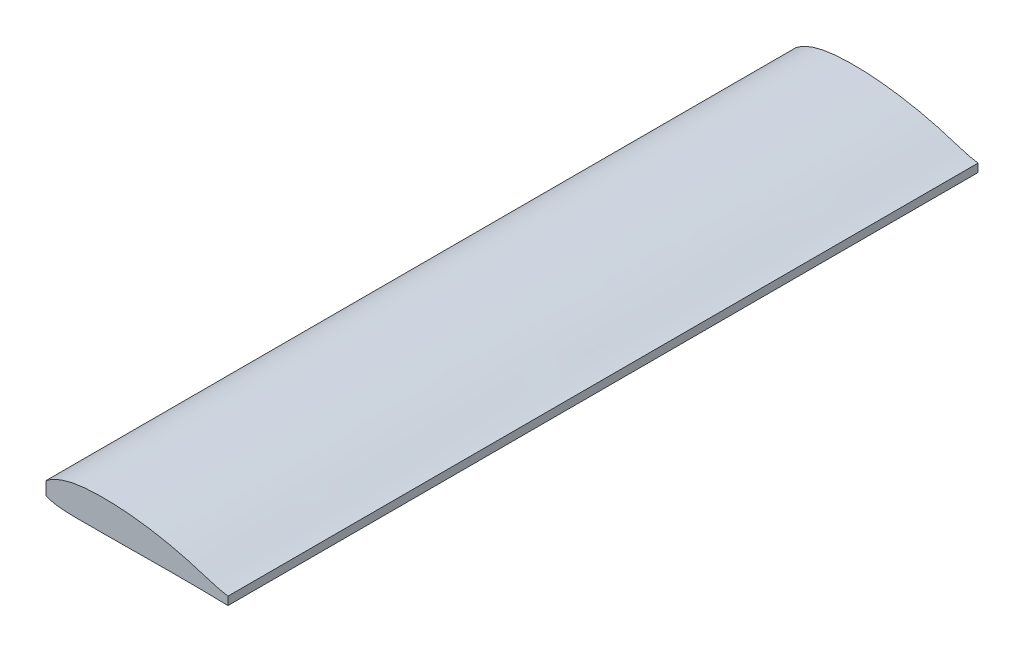
ISO-10303-21;
HEADER;
FILE_DESCRIPTION(('STEP AP214'),'2;1');
FILE_NAME('part.step','',(''),(''),'','','');
FILE_SCHEMA(('AUTOMOTIVE_DESIGN { 1 0 10303 214 1 1 1 1 }'));
ENDSEC;
DATA;
#1=APPLICATION_CONTEXT('core data for automotive mechanical design processes');
#2=APPLICATION_PROTOCOL_DEFINITION('international standard','automotive_design',2000,#1);
#3=PRODUCT_CONTEXT('',#1,'mechanical');
#4=PRODUCT('Part','Part','',(#3));
#5=PRODUCT_RELATED_PRODUCT_CATEGORY('part','',(#4));
#6=PRODUCT_DEFINITION_FORMATION('','',#4);
#7=PRODUCT_DEFINITION_CONTEXT('part definition',#1,'design');
#8=PRODUCT_DEFINITION('design','',#6,#7);
#9=PRODUCT_DEFINITION_SHAPE('','',#8);
#10=(LENGTH_UNIT() NAMED_UNIT(*) SI_UNIT(.MILLI.,.METRE.));
#11=(NAMED_UNIT(*) PLANE_ANGLE_UNIT() SI_UNIT($,.RADIAN.));
#12=(NAMED_UNIT(*) SI_UNIT($,.STERADIAN.) SOLID_ANGLE_UNIT());
#13=UNCERTAINTY_MEASURE_WITH_UNIT(LENGTH_MEASURE(1.E-05),#10,'distance_accuracy_value','');
#14=(GEOMETRIC_REPRESENTATION_CONTEXT(3) GLOBAL_UNCERTAINTY_ASSIGNED_CONTEXT((#13)) GLOBAL_UNIT_ASSIGNED_CONTEXT((#10,
#11,#12)) REPRESENTATION_CONTEXT('',''));
#15=CARTESIAN_POINT('',(0.,0.,0.));
#16=DIRECTION('',(0.,0.,1.));
#17=DIRECTION('',(1.,0.,0.));
#18=AXIS2_PLACEMENT_3D('',#15,#16,#17);
#19=CARTESIAN_POINT('',(-63.4540757757714,-9.25598325643386,-450.));
#20=CARTESIAN_POINT('',(-54.0351444598893,-15.0654729766079,-450.));
#21=CARTESIAN_POINT('',(10.6002544080413,-16.0386683097575,-450.));
#22=CARTESIAN_POINT('',(100.614002117736,-13.7875839752063,-450.));
#23=CARTESIAN_POINT('',(156.545924224229,-15.4448692068075,-450.));
#24=B_SPLINE_CURVE_WITH_KNOTS('',3,(#19,#20,#21,#22,#23),.UNSPECIFIED.,.F.,.F.,(4,1,4),(0.,
0.231899451469251,1.),.UNSPECIFIED.);
#25=DIRECTION('',(0.,0.,1.));
#26=VECTOR('',#25,1.);
#27=SURFACE_OF_LINEAR_EXTRUSION('',#24,#26);
#28=DIRECTION('',(0.,0.,1.));
#29=VECTOR('',#28,1.);
#30=CARTESIAN_POINT('',(-61.8161263304696,-10.1824199040912,-450.));
#31=LINE('',#30,#29);
#32=CARTESIAN_POINT('',(-61.8161263304696,-10.1824199035204,-450.));
#33=VERTEX_POINT('',#32);
#34=CARTESIAN_POINT('',(-61.8161263315707,-10.1824199035204,450.));
#35=VERTEX_POINT('',#34);
#36=EDGE_CURVE('E50',#33,#35,#31,.T.);
#37=ORIENTED_EDGE('',*,*,#36,.F.);
#38=CARTESIAN_POINT('',(156.545924224229,-15.4448692068075,-450.));
#39=VERTEX_POINT('',#38);
#40=EDGE_CURVE('E88',#33,#39,#24,.T.);
#41=ORIENTED_EDGE('',*,*,#40,.T.);
#42=DIRECTION('',(0.,0.,1.));
#43=VECTOR('',#42,1.);
#44=CARTESIAN_POINT('',(156.545924224229,-15.4448692068075,-450.));
#45=LINE('',#44,#43);
#46=CARTESIAN_POINT('',(156.545924224229,-15.4448692068075,450.));
#47=VERTEX_POINT('',#46);
#48=EDGE_CURVE('E112',#39,#47,#45,.T.);
#49=ORIENTED_EDGE('',*,*,#48,.T.);
#50=CARTESIAN_POINT('',(-63.4540757757714,-9.25598325643386,450.));
#51=CARTESIAN_POINT('',(-54.0351444598893,-15.0654729766079,450.));
#52=CARTESIAN_POINT('',(10.6002544080413,-16.0386683097575,450.));
#53=CARTESIAN_POINT('',(100.614002117736,-13.7875839752063,450.));
#54=CARTESIAN_POINT('',(156.545924224229,-15.4448692068075,450.));
#55=B_SPLINE_CURVE_WITH_KNOTS('',3,(#50,#51,#52,#53,#54),.UNSPECIFIED.,.F.,.F.,(4,1,4),(0.,
0.231899451469251,1.),.UNSPECIFIED.);
#56=EDGE_CURVE('E91',#35,#47,#55,.T.);
#57=ORIENTED_EDGE('',*,*,#56,.F.);
#58=EDGE_LOOP('',(#37,#41,#49,#57));
#59=FACE_BOUND('',#58,.T.);
#60=ADVANCED_FACE('F35',(#59),#27,.T.);
#61=CARTESIAN_POINT('',(156.545924224229,-5.59219082881144,-450.));
#62=CARTESIAN_POINT('',(145.15488491756,-4.0867309047516,-450.));
#63=CARTESIAN_POINT('',(97.0432886292072,13.2048715110859,-450.));
#64=CARTESIAN_POINT('',(12.4624646532749,27.2231836560255,-450.));
#65=CARTESIAN_POINT('',(-47.4947704977808,17.3868082440156,-450.));
#66=CARTESIAN_POINT('',(-63.4540757757714,3.9562722725695,-450.));
#67=B_SPLINE_CURVE_WITH_KNOTS('',3,(#61,#62,#63,#64,#65,#66),.UNSPECIFIED.,.F.,.F.,(4,1,1,4),
(0.,0.166541343545136,0.680643308012216,1.),.UNSPECIFIED.);
#68=DIRECTION('',(0.,0.,1.));
#69=VECTOR('',#68,1.);
#70=SURFACE_OF_LINEAR_EXTRUSION('',#67,#69);
#71=DIRECTION('',(0.,0.,1.));
#72=VECTOR('',#71,1.);
#73=CARTESIAN_POINT('',(-61.8161263304696,5.28203326129564,-450.));
#74=LINE('',#73,#72);
#75=CARTESIAN_POINT('',(-61.8161263304696,5.28203326886805,450.));
#76=VERTEX_POINT('',#75);
#77=CARTESIAN_POINT('',(-61.8161263304696,5.28203326886805,-450.));
#78=VERTEX_POINT('',#77);
#79=EDGE_CURVE('E74',#76,#78,#74,.F.);
#80=ORIENTED_EDGE('',*,*,#79,.F.);
#81=CARTESIAN_POINT('',(156.545924224229,-5.59219082881144,450.));
#82=CARTESIAN_POINT('',(145.15488491756,-4.0867309047516,450.));
#83=CARTESIAN_POINT('',(97.0432886292072,13.2048715110859,450.));
#84=CARTESIAN_POINT('',(12.4624646532749,27.2231836560255,450.));
#85=CARTESIAN_POINT('',(-47.4947704977808,17.3868082440156,450.));
#86=CARTESIAN_POINT('',(-63.4540757757714,3.9562722725695,450.));
#87=B_SPLINE_CURVE_WITH_KNOTS('',3,(#81,#82,#83,#84,#85,#86),.UNSPECIFIED.,.F.,.F.,(4,1,1,4),
(0.,0.166541343545136,0.680643308012216,1.),.UNSPECIFIED.);
#88=CARTESIAN_POINT('',(156.545924224229,-5.59219082881144,450.));
#89=VERTEX_POINT('',#88);
#90=EDGE_CURVE('E80',#89,#76,#87,.T.);
#91=ORIENTED_EDGE('',*,*,#90,.F.);
#92=DIRECTION('',(0.,0.,1.));
#93=VECTOR('',#92,1.);
#94=CARTESIAN_POINT('',(156.545924224229,-5.59219082881144,-450.));
#95=LINE('',#94,#93);
#96=CARTESIAN_POINT('',(156.545924224229,-5.59219082881144,-450.));
#97=VERTEX_POINT('',#96);
#98=EDGE_CURVE('E43',#97,#89,#95,.T.);
#99=ORIENTED_EDGE('',*,*,#98,.F.);
#100=EDGE_CURVE('E81',#97,#78,#67,.T.);
#101=ORIENTED_EDGE('',*,*,#100,.T.);
#102=EDGE_LOOP('',(#80,#91,#99,#101));
#103=FACE_BOUND('',#102,.T.);
#104=ADVANCED_FACE('F79',(#103),#70,.T.);
#105=CARTESIAN_POINT('',(156.545924224229,-5.59219082881144,-450.));
#106=DIRECTION('',(1.,0.,0.));
#107=DIRECTION('',(0.,0.,-1.));
#108=AXIS2_PLACEMENT_3D('',#105,#106,#107);
#109=PLANE('',#108);
#110=ORIENTED_EDGE('',*,*,#98,.T.);
#111=DIRECTION('',(0.,1.,0.));
#112=VECTOR('',#111,1.);
#113=CARTESIAN_POINT('',(156.545924224229,-5.59219082881144,450.));
#114=LINE('',#113,#112);
#115=EDGE_CURVE('E87',#47,#89,#114,.T.);
#116=ORIENTED_EDGE('',*,*,#115,.F.);
#117=ORIENTED_EDGE('',*,*,#48,.F.);
#118=DIRECTION('',(0.,1.,0.));
#119=VECTOR('',#118,1.);
#120=CARTESIAN_POINT('',(156.545924224229,-5.59219082881144,-450.));
#121=LINE('',#120,#119);
#122=EDGE_CURVE('E90',#39,#97,#121,.T.);
#123=ORIENTED_EDGE('',*,*,#122,.T.);
#124=EDGE_LOOP('',(#110,#116,#117,#123));
#125=FACE_BOUND('',#124,.T.);
#126=ADVANCED_FACE('F119',(#125),#109,.T.);
#127=CARTESIAN_POINT('',(38.3013896104652,-15.0544374492117,-450.));
#128=DIRECTION('',(0.,0.,-1.));
#129=DIRECTION('',(-1.,0.,0.));
#130=AXIS2_PLACEMENT_3D('',#127,#128,#129);
#131=PLANE('',#130);
#132=DIRECTION('',(0.,1.,0.));
#133=VECTOR('',#132,1.);
#134=CARTESIAN_POINT('',(-61.8161263304696,-16.0386683097575,-450.));
#135=LINE('',#134,#133);
#136=EDGE_CURVE('E82',#33,#78,#135,.T.);
#137=ORIENTED_EDGE('',*,*,#136,.T.);
#138=ORIENTED_EDGE('',*,*,#100,.F.);
#139=ORIENTED_EDGE('',*,*,#122,.F.);
#140=ORIENTED_EDGE('',*,*,#40,.F.);
#141=EDGE_LOOP('',(#137,#138,#139,#140));
#142=FACE_BOUND('',#141,.T.);
#143=ADVANCED_FACE('F120',(#142),#131,.T.);
#144=CARTESIAN_POINT('',(38.3013896104652,-15.0544374492117,450.));
#145=DIRECTION('',(0.,0.,-1.));
#146=DIRECTION('',(-1.,0.,0.));
#147=AXIS2_PLACEMENT_3D('',#144,#145,#146);
#148=PLANE('',#147);
#149=ORIENTED_EDGE('',*,*,#90,.T.);
#150=DIRECTION('',(0.,-1.,0.));
#151=VECTOR('',#150,1.);
#152=CARTESIAN_POINT('',(-61.8161263304696,-15.0544374492117,450.));
#153=LINE('',#152,#151);
#154=EDGE_CURVE('E11',#76,#35,#153,.T.);
#155=ORIENTED_EDGE('',*,*,#154,.T.);
#156=ORIENTED_EDGE('',*,*,#56,.T.);
#157=ORIENTED_EDGE('',*,*,#115,.T.);
#158=EDGE_LOOP('',(#149,#155,#156,#157));
#159=FACE_BOUND('',#158,.T.);
#160=ADVANCED_FACE('F85',(#159),#148,.F.);
#161=CARTESIAN_POINT('',(-61.8161263304696,-16.0386683097575,0.));
#162=DIRECTION('',(1.,0.,0.));
#163=DIRECTION('',(0.,0.,-1.));
#164=AXIS2_PLACEMENT_3D('',#161,#162,#163);
#165=PLANE('',#164);
#166=ORIENTED_EDGE('',*,*,#36,.T.);
#167=ORIENTED_EDGE('',*,*,#154,.F.);
#168=ORIENTED_EDGE('',*,*,#79,.T.);
#169=ORIENTED_EDGE('',*,*,#136,.F.);
#170=EDGE_LOOP('',(#166,#167,#168,#169));
#171=FACE_BOUND('',#170,.T.);
#172=ADVANCED_FACE('F73',(#171),#165,.F.);
#173=CLOSED_SHELL('',(#60,#104,#126,#143,#160,#172));
#174=MANIFOLD_SOLID_BREP('B2',#173);
#175=ADVANCED_BREP_SHAPE_REPRESENTATION('',(#18,#174),#14);
#176=SHAPE_DEFINITION_REPRESENTATION(#9,#175);
ENDSEC;
END-ISO-10303-21;
